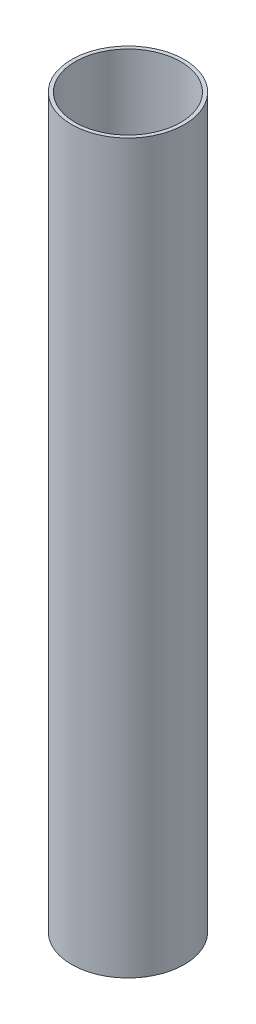
ISO-10303-21;
HEADER;
FILE_DESCRIPTION(('STEP AP214'),'2;1');
FILE_NAME('part.step','',(''),(''),'','','');
FILE_SCHEMA(('AUTOMOTIVE_DESIGN { 1 0 10303 214 1 1 1 1 }'));
ENDSEC;
DATA;
#1=APPLICATION_CONTEXT('core data for automotive mechanical design processes');
#2=APPLICATION_PROTOCOL_DEFINITION('international standard','automotive_design',2000,#1);
#3=PRODUCT_CONTEXT('',#1,'mechanical');
#4=PRODUCT('Part','Part','',(#3));
#5=PRODUCT_RELATED_PRODUCT_CATEGORY('part','',(#4));
#6=PRODUCT_DEFINITION_FORMATION('','',#4);
#7=PRODUCT_DEFINITION_CONTEXT('part definition',#1,'design');
#8=PRODUCT_DEFINITION('design','',#6,#7);
#9=PRODUCT_DEFINITION_SHAPE('','',#8);
#10=(LENGTH_UNIT() NAMED_UNIT(*) SI_UNIT(.MILLI.,.METRE.));
#11=(NAMED_UNIT(*) PLANE_ANGLE_UNIT() SI_UNIT($,.RADIAN.));
#12=(NAMED_UNIT(*) SI_UNIT($,.STERADIAN.) SOLID_ANGLE_UNIT());
#13=UNCERTAINTY_MEASURE_WITH_UNIT(LENGTH_MEASURE(1.E-05),#10,'distance_accuracy_value','');
#14=(GEOMETRIC_REPRESENTATION_CONTEXT(3) GLOBAL_UNCERTAINTY_ASSIGNED_CONTEXT((#13)) GLOBAL_UNIT_ASSIGNED_CONTEXT((#10,
#11,#12)) REPRESENTATION_CONTEXT('',''));
#15=CARTESIAN_POINT('',(0.,0.,0.));
#16=DIRECTION('',(0.,0.,1.));
#17=DIRECTION('',(1.,0.,0.));
#18=AXIS2_PLACEMENT_3D('',#15,#16,#17);
#19=CARTESIAN_POINT('',(0.,200.,0.));
#20=DIRECTION('',(0.,1.,0.));
#21=DIRECTION('',(0.,0.,1.));
#22=AXIS2_PLACEMENT_3D('',#19,#20,#21);
#23=PLANE('',#22);
#24=CARTESIAN_POINT('',(0.,200.,0.));
#25=DIRECTION('',(0.,1.,0.));
#26=DIRECTION('',(0.,0.,1.));
#27=AXIS2_PLACEMENT_3D('',#24,#25,#26);
#28=CIRCLE('',#27,15.5);
#29=CARTESIAN_POINT('',(0.,200.,15.5));
#30=VERTEX_POINT('',#29);
#31=EDGE_CURVE('E10',#30,#30,#28,.T.);
#32=ORIENTED_EDGE('',*,*,#31,.T.);
#33=EDGE_LOOP('',(#32));
#34=FACE_BOUND('',#33,.T.);
#35=CARTESIAN_POINT('',(0.,200.,0.));
#36=DIRECTION('',(0.,1.,0.));
#37=DIRECTION('',(0.,0.,1.));
#38=AXIS2_PLACEMENT_3D('',#35,#36,#37);
#39=CIRCLE('',#38,14.5);
#40=CARTESIAN_POINT('',(0.,200.,14.5));
#41=VERTEX_POINT('',#40);
#42=EDGE_CURVE('E42',#41,#41,#39,.T.);
#43=ORIENTED_EDGE('',*,*,#42,.F.);
#44=EDGE_LOOP('',(#43));
#45=FACE_BOUND('',#44,.T.);
#46=ADVANCED_FACE('F31',(#34,#45),#23,.T.);
#47=CARTESIAN_POINT('',(0.,0.,0.));
#48=DIRECTION('',(0.,1.,0.));
#49=DIRECTION('',(0.,0.,1.));
#50=AXIS2_PLACEMENT_3D('',#47,#48,#49);
#51=PLANE('',#50);
#52=CARTESIAN_POINT('',(0.,0.,0.));
#53=DIRECTION('',(0.,1.,0.));
#54=DIRECTION('',(0.,0.,1.));
#55=AXIS2_PLACEMENT_3D('',#52,#53,#54);
#56=CIRCLE('',#55,15.5);
#57=CARTESIAN_POINT('',(0.,0.,15.5));
#58=VERTEX_POINT('',#57);
#59=EDGE_CURVE('E35',#58,#58,#56,.T.);
#60=ORIENTED_EDGE('',*,*,#59,.F.);
#61=EDGE_LOOP('',(#60));
#62=FACE_BOUND('',#61,.T.);
#63=CARTESIAN_POINT('',(0.,0.,0.));
#64=DIRECTION('',(0.,1.,0.));
#65=DIRECTION('',(0.,0.,1.));
#66=AXIS2_PLACEMENT_3D('',#63,#64,#65);
#67=CIRCLE('',#66,14.5);
#68=CARTESIAN_POINT('',(0.,0.,14.5));
#69=VERTEX_POINT('',#68);
#70=EDGE_CURVE('E44',#69,#69,#67,.T.);
#71=ORIENTED_EDGE('',*,*,#70,.T.);
#72=EDGE_LOOP('',(#71));
#73=FACE_BOUND('',#72,.T.);
#74=ADVANCED_FACE('F54',(#62,#73),#51,.F.);
#75=CARTESIAN_POINT('',(0.,200.,0.));
#76=DIRECTION('',(0.,-1.,0.));
#77=DIRECTION('',(0.,0.,-1.));
#78=AXIS2_PLACEMENT_3D('',#75,#76,#77);
#79=CYLINDRICAL_SURFACE('',#78,15.5);
#80=ORIENTED_EDGE('',*,*,#31,.F.);
#81=EDGE_LOOP('',(#80));
#82=FACE_BOUND('',#81,.T.);
#83=ORIENTED_EDGE('',*,*,#59,.T.);
#84=EDGE_LOOP('',(#83));
#85=FACE_BOUND('',#84,.T.);
#86=ADVANCED_FACE('F33',(#82,#85),#79,.T.);
#87=CARTESIAN_POINT('',(0.,200.,0.));
#88=DIRECTION('',(0.,-1.,0.));
#89=DIRECTION('',(0.,0.,-1.));
#90=AXIS2_PLACEMENT_3D('',#87,#88,#89);
#91=CYLINDRICAL_SURFACE('',#90,14.5);
#92=ORIENTED_EDGE('',*,*,#42,.T.);
#93=EDGE_LOOP('',(#92));
#94=FACE_BOUND('',#93,.T.);
#95=ORIENTED_EDGE('',*,*,#70,.F.);
#96=EDGE_LOOP('',(#95));
#97=FACE_BOUND('',#96,.T.);
#98=ADVANCED_FACE('F50',(#94,#97),#91,.F.);
#99=CLOSED_SHELL('',(#46,#74,#86,#98));
#100=MANIFOLD_SOLID_BREP('B2',#99);
#101=ADVANCED_BREP_SHAPE_REPRESENTATION('',(#18,#100),#14);
#102=SHAPE_DEFINITION_REPRESENTATION(#9,#101);
ENDSEC;
END-ISO-10303-21;
